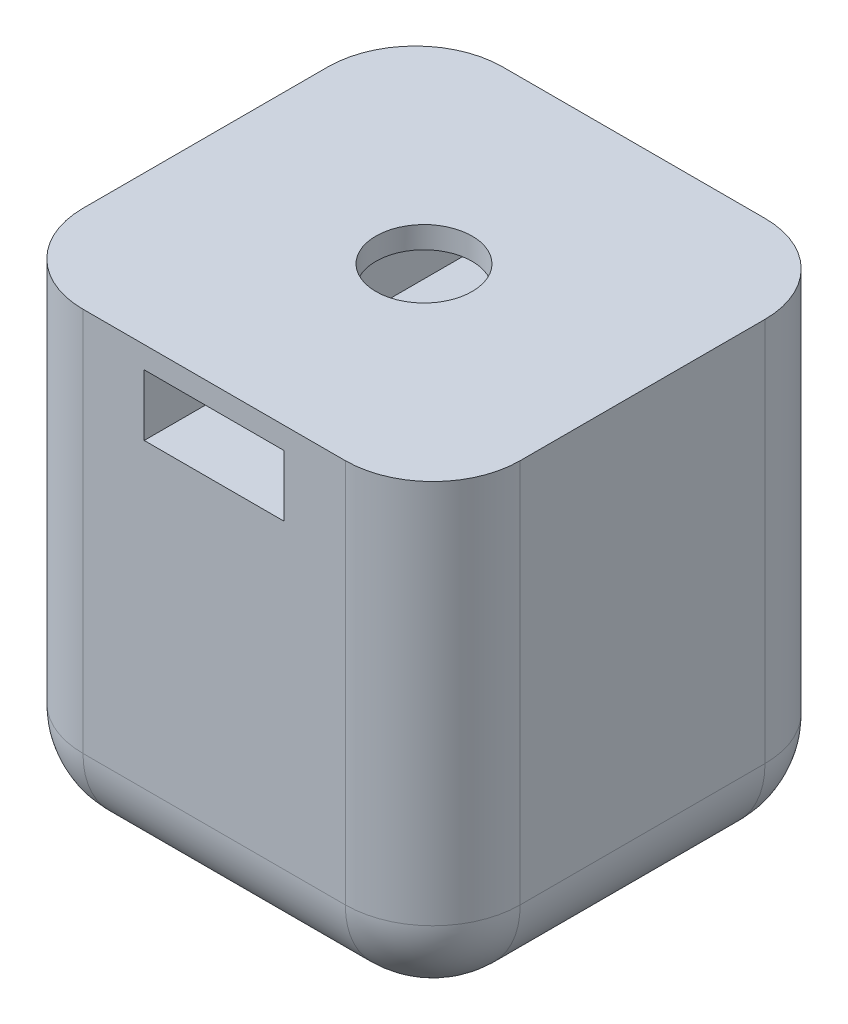
ISO-10303-21;
HEADER;
FILE_DESCRIPTION(('STEP AP214'),'2;1');
FILE_NAME('part.step','',(''),(''),'','','');
FILE_SCHEMA(('AUTOMOTIVE_DESIGN { 1 0 10303 214 1 1 1 1 }'));
ENDSEC;
DATA;
#1=APPLICATION_CONTEXT('core data for automotive mechanical design processes');
#2=APPLICATION_PROTOCOL_DEFINITION('international standard','automotive_design',2000,#1);
#3=PRODUCT_CONTEXT('',#1,'mechanical');
#4=PRODUCT('Part','Part','',(#3));
#5=PRODUCT_RELATED_PRODUCT_CATEGORY('part','',(#4));
#6=PRODUCT_DEFINITION_FORMATION('','',#4);
#7=PRODUCT_DEFINITION_CONTEXT('part definition',#1,'design');
#8=PRODUCT_DEFINITION('design','',#6,#7);
#9=PRODUCT_DEFINITION_SHAPE('','',#8);
#10=(LENGTH_UNIT() NAMED_UNIT(*) SI_UNIT(.MILLI.,.METRE.));
#11=(NAMED_UNIT(*) PLANE_ANGLE_UNIT() SI_UNIT($,.RADIAN.));
#12=(NAMED_UNIT(*) SI_UNIT($,.STERADIAN.) SOLID_ANGLE_UNIT());
#13=UNCERTAINTY_MEASURE_WITH_UNIT(LENGTH_MEASURE(1.E-05),#10,'distance_accuracy_value','');
#14=(GEOMETRIC_REPRESENTATION_CONTEXT(3) GLOBAL_UNCERTAINTY_ASSIGNED_CONTEXT((#13)) GLOBAL_UNIT_ASSIGNED_CONTEXT((#10,
#11,#12)) REPRESENTATION_CONTEXT('',''));
#15=CARTESIAN_POINT('',(0.,0.,0.));
#16=DIRECTION('',(0.,0.,1.));
#17=DIRECTION('',(1.,0.,0.));
#18=AXIS2_PLACEMENT_3D('',#15,#16,#17);
#19=CARTESIAN_POINT('',(0.,0.,0.));
#20=DIRECTION('',(0.,-1.,0.));
#21=DIRECTION('',(0.,0.,-1.));
#22=AXIS2_PLACEMENT_3D('',#19,#20,#21);
#23=PLANE('',#22);
#24=CARTESIAN_POINT('',(0.,0.,-2.));
#25=DIRECTION('',(0.,1.,0.));
#26=DIRECTION('',(0.,0.,1.));
#27=AXIS2_PLACEMENT_3D('',#24,#25,#26);
#28=CIRCLE('',#27,2.75);
#29=CARTESIAN_POINT('',(0.,0.,0.750000000000003));
#30=VERTEX_POINT('',#29);
#31=EDGE_CURVE('E233',#30,#30,#28,.T.);
#32=ORIENTED_EDGE('',*,*,#31,.F.);
#33=EDGE_LOOP('',(#32));
#34=FACE_BOUND('',#33,.T.);
#35=DIRECTION('',(1.,0.,0.));
#36=VECTOR('',#35,1.);
#37=CARTESIAN_POINT('',(0.,0.,10.));
#38=LINE('',#37,#36);
#39=CARTESIAN_POINT('',(-7.5,0.,10.));
#40=VERTEX_POINT('',#39);
#41=CARTESIAN_POINT('',(7.5,0.,10.));
#42=VERTEX_POINT('',#41);
#43=EDGE_CURVE('E378',#40,#42,#38,.T.);
#44=ORIENTED_EDGE('',*,*,#43,.T.);
#45=CARTESIAN_POINT('',(7.5,0.,5.));
#46=DIRECTION('',(0.,-1.,0.));
#47=DIRECTION('',(0.,0.,-1.));
#48=AXIS2_PLACEMENT_3D('',#45,#46,#47);
#49=CIRCLE('',#48,5.);
#50=CARTESIAN_POINT('',(12.5,0.,5.));
#51=VERTEX_POINT('',#50);
#52=EDGE_CURVE('E11',#42,#51,#49,.F.);
#53=ORIENTED_EDGE('',*,*,#52,.T.);
#54=DIRECTION('',(0.,0.,-1.));
#55=VECTOR('',#54,1.);
#56=CARTESIAN_POINT('',(12.5,0.,10.));
#57=LINE('',#56,#55);
#58=CARTESIAN_POINT('',(12.5,0.,-9.));
#59=VERTEX_POINT('',#58);
#60=EDGE_CURVE('E418',#59,#51,#57,.F.);
#61=ORIENTED_EDGE('',*,*,#60,.F.);
#62=CARTESIAN_POINT('',(7.5,0.,-9.));
#63=DIRECTION('',(0.,-1.,0.));
#64=DIRECTION('',(0.,0.,-1.));
#65=AXIS2_PLACEMENT_3D('',#62,#63,#64);
#66=CIRCLE('',#65,5.);
#67=CARTESIAN_POINT('',(7.5,0.,-14.));
#68=VERTEX_POINT('',#67);
#69=EDGE_CURVE('E58',#59,#68,#66,.F.);
#70=ORIENTED_EDGE('',*,*,#69,.T.);
#71=DIRECTION('',(-1.,0.,0.));
#72=VECTOR('',#71,1.);
#73=CARTESIAN_POINT('',(0.,0.,-14.));
#74=LINE('',#73,#72);
#75=CARTESIAN_POINT('',(-7.5,0.,-14.));
#76=VERTEX_POINT('',#75);
#77=EDGE_CURVE('E74',#68,#76,#74,.T.);
#78=ORIENTED_EDGE('',*,*,#77,.T.);
#79=CARTESIAN_POINT('',(-7.5,0.,-9.));
#80=DIRECTION('',(0.,1.,0.));
#81=DIRECTION('',(0.,0.,1.));
#82=AXIS2_PLACEMENT_3D('',#79,#80,#81);
#83=CIRCLE('',#82,5.);
#84=CARTESIAN_POINT('',(-12.5,0.,-9.));
#85=VERTEX_POINT('',#84);
#86=EDGE_CURVE('E445',#85,#76,#83,.F.);
#87=ORIENTED_EDGE('',*,*,#86,.F.);
#88=DIRECTION('',(0.,0.,-1.));
#89=VECTOR('',#88,1.);
#90=CARTESIAN_POINT('',(-12.5,0.,10.));
#91=LINE('',#90,#89);
#92=CARTESIAN_POINT('',(-12.5,0.,5.));
#93=VERTEX_POINT('',#92);
#94=EDGE_CURVE('E389',#93,#85,#91,.T.);
#95=ORIENTED_EDGE('',*,*,#94,.F.);
#96=CARTESIAN_POINT('',(-7.5,0.,5.));
#97=DIRECTION('',(0.,1.,0.));
#98=DIRECTION('',(0.,0.,1.));
#99=AXIS2_PLACEMENT_3D('',#96,#97,#98);
#100=CIRCLE('',#99,5.);
#101=EDGE_CURVE('E385',#40,#93,#100,.F.);
#102=ORIENTED_EDGE('',*,*,#101,.F.);
#103=EDGE_LOOP('',(#44,#53,#61,#70,#78,#87,#95,#102));
#104=FACE_BOUND('',#103,.T.);
#105=ADVANCED_FACE('F49',(#34,#104),#23,.F.);
#106=CARTESIAN_POINT('',(0.,-17.,0.));
#107=DIRECTION('',(0.,-1.,0.));
#108=DIRECTION('',(0.,0.,-1.));
#109=AXIS2_PLACEMENT_3D('',#106,#107,#108);
#110=PLANE('',#109);
#111=CARTESIAN_POINT('',(0.,-17.,-2.));
#112=DIRECTION('',(0.,-1.,0.));
#113=DIRECTION('',(0.,0.,-1.));
#114=AXIS2_PLACEMENT_3D('',#111,#112,#113);
#115=CIRCLE('',#114,9.8);
#116=CARTESIAN_POINT('',(0.,-17.,-11.8));
#117=VERTEX_POINT('',#116);
#118=EDGE_CURVE('E237',#117,#117,#115,.T.);
#119=ORIENTED_EDGE('',*,*,#118,.T.);
#120=EDGE_LOOP('',(#119));
#121=FACE_BOUND('',#120,.T.);
#122=ADVANCED_FACE('F310',(#121),#110,.T.);
#123=CARTESIAN_POINT('',(0.,-27.,0.));
#124=DIRECTION('',(0.,-1.,0.));
#125=DIRECTION('',(0.,0.,-1.));
#126=AXIS2_PLACEMENT_3D('',#123,#124,#125);
#127=PLANE('',#126);
#128=CARTESIAN_POINT('',(0.,-27.,-2.));
#129=DIRECTION('',(0.,-1.,0.));
#130=DIRECTION('',(0.,0.,-1.));
#131=AXIS2_PLACEMENT_3D('',#128,#129,#130);
#132=CIRCLE('',#131,9.8);
#133=CARTESIAN_POINT('',(7.5,-27.,4.30793151516407));
#134=VERTEX_POINT('',#133);
#135=CARTESIAN_POINT('',(6.85857127979291,-27.,5.));
#136=VERTEX_POINT('',#135);
#137=EDGE_CURVE('E246',#134,#136,#132,.T.);
#138=ORIENTED_EDGE('',*,*,#137,.F.);
#139=DIRECTION('',(0.,0.,1.));
#140=VECTOR('',#139,1.);
#141=CARTESIAN_POINT('',(7.5,-27.,0.));
#142=LINE('',#141,#140);
#143=CARTESIAN_POINT('',(7.5,-27.,5.));
#144=VERTEX_POINT('',#143);
#145=EDGE_CURVE('E267',#134,#144,#142,.T.);
#146=ORIENTED_EDGE('',*,*,#145,.T.);
#147=DIRECTION('',(-1.,0.,0.));
#148=VECTOR('',#147,1.);
#149=CARTESIAN_POINT('',(0.,-27.,5.));
#150=LINE('',#149,#148);
#151=EDGE_CURVE('E264',#144,#136,#150,.T.);
#152=ORIENTED_EDGE('',*,*,#151,.T.);
#153=EDGE_LOOP('',(#138,#146,#152));
#154=FACE_BOUND('',#153,.T.);
#155=ADVANCED_FACE('F373',(#154),#127,.T.);
#156=DIRECTION('',(-1.,0.,0.));
#157=VECTOR('',#156,1.);
#158=CARTESIAN_POINT('',(0.,-27.,5.));
#159=LINE('',#158,#157);
#160=CARTESIAN_POINT('',(-6.85857127979291,-27.,5.));
#161=VERTEX_POINT('',#160);
#162=CARTESIAN_POINT('',(-7.5,-27.,5.));
#163=VERTEX_POINT('',#162);
#164=EDGE_CURVE('E257',#161,#163,#159,.T.);
#165=ORIENTED_EDGE('',*,*,#164,.T.);
#166=DIRECTION('',(0.,0.,1.));
#167=VECTOR('',#166,1.);
#168=CARTESIAN_POINT('',(-7.5,-27.,-14.));
#169=LINE('',#168,#167);
#170=CARTESIAN_POINT('',(-7.5,-27.,4.30793151516407));
#171=VERTEX_POINT('',#170);
#172=EDGE_CURVE('E260',#163,#171,#169,.F.);
#173=ORIENTED_EDGE('',*,*,#172,.T.);
#174=EDGE_CURVE('E743',#161,#171,#132,.T.);
#175=ORIENTED_EDGE('',*,*,#174,.F.);
#176=EDGE_LOOP('',(#165,#173,#175));
#177=FACE_BOUND('',#176,.T.);
#178=ADVANCED_FACE('F312',(#177),#127,.T.);
#179=CARTESIAN_POINT('',(6.8585712797929,-27.,-9.));
#180=VERTEX_POINT('',#179);
#181=CARTESIAN_POINT('',(7.5,-27.,-8.30793151516407));
#182=VERTEX_POINT('',#181);
#183=EDGE_CURVE('E242',#180,#182,#132,.T.);
#184=ORIENTED_EDGE('',*,*,#183,.F.);
#185=DIRECTION('',(-1.,0.,0.));
#186=VECTOR('',#185,1.);
#187=CARTESIAN_POINT('',(0.,-27.,-9.));
#188=LINE('',#187,#186);
#189=CARTESIAN_POINT('',(7.5,-27.,-9.));
#190=VERTEX_POINT('',#189);
#191=EDGE_CURVE('E273',#180,#190,#188,.F.);
#192=ORIENTED_EDGE('',*,*,#191,.T.);
#193=DIRECTION('',(0.,0.,1.));
#194=VECTOR('',#193,1.);
#195=CARTESIAN_POINT('',(7.5,-27.,0.));
#196=LINE('',#195,#194);
#197=EDGE_CURVE('E270',#190,#182,#196,.T.);
#198=ORIENTED_EDGE('',*,*,#197,.T.);
#199=EDGE_LOOP('',(#184,#192,#198));
#200=FACE_BOUND('',#199,.T.);
#201=ADVANCED_FACE('F606',(#200),#127,.T.);
#202=CARTESIAN_POINT('',(-7.5,-27.,-8.30793151516407));
#203=VERTEX_POINT('',#202);
#204=CARTESIAN_POINT('',(-6.8585712797929,-27.,-9.));
#205=VERTEX_POINT('',#204);
#206=EDGE_CURVE('E247',#203,#205,#132,.T.);
#207=ORIENTED_EDGE('',*,*,#206,.F.);
#208=DIRECTION('',(0.,0.,1.));
#209=VECTOR('',#208,1.);
#210=CARTESIAN_POINT('',(-7.5,-27.,-14.));
#211=LINE('',#210,#209);
#212=CARTESIAN_POINT('',(-7.5,-27.,-9.));
#213=VERTEX_POINT('',#212);
#214=EDGE_CURVE('E279',#203,#213,#211,.F.);
#215=ORIENTED_EDGE('',*,*,#214,.T.);
#216=DIRECTION('',(-1.,0.,0.));
#217=VECTOR('',#216,1.);
#218=CARTESIAN_POINT('',(0.,-27.,-9.));
#219=LINE('',#218,#217);
#220=EDGE_CURVE('E276',#213,#205,#219,.F.);
#221=ORIENTED_EDGE('',*,*,#220,.T.);
#222=EDGE_LOOP('',(#207,#215,#221));
#223=FACE_BOUND('',#222,.T.);
#224=ADVANCED_FACE('F308',(#223),#127,.T.);
#225=CARTESIAN_POINT('',(0.,-17.,-2.));
#226=DIRECTION('',(0.,-1.,0.));
#227=DIRECTION('',(0.,0.,-1.));
#228=AXIS2_PLACEMENT_3D('',#225,#226,#227);
#229=CYLINDRICAL_SURFACE('',#228,9.8);
#230=ORIENTED_EDGE('',*,*,#118,.F.);
#231=EDGE_LOOP('',(#230));
#232=FACE_BOUND('',#231,.T.);
#233=ORIENTED_EDGE('',*,*,#174,.T.);
#234=CARTESIAN_POINT('',(-7.5,-27.,4.30793151516407));
#235=CARTESIAN_POINT('',(-7.63620021715893,-26.9999742193658,4.14602059318535));
#236=CARTESIAN_POINT('',(-7.76705313468663,-26.9944373435396,3.97976753927116));
#237=CARTESIAN_POINT('',(-8.01740448975888,-26.9747464813245,3.63965145456038));
#238=CARTESIAN_POINT('',(-8.13691445219486,-26.9606013519917,3.46579641589242));
#239=CARTESIAN_POINT('',(-8.3642191409018,-26.9260865631808,3.11118756612205));
#240=CARTESIAN_POINT('',(-8.47201209603152,-26.9057159644304,2.93043271760955));
#241=CARTESIAN_POINT('',(-8.67559437960381,-26.8609511452333,2.56270123067464));
#242=CARTESIAN_POINT('',(-8.77137945154097,-26.8365555050637,2.3757224155615));
#243=CARTESIAN_POINT('',(-8.96659804394256,-26.7813317283755,1.96247558663533));
#244=CARTESIAN_POINT('',(-9.0636540707442,-26.7501309730978,1.73513123012862));
#245=CARTESIAN_POINT('',(-9.24034438332457,-26.6882796039221,1.27369467682066));
#246=CARTESIAN_POINT('',(-9.31997801853788,-26.6576290106068,1.03960222840977));
#247=CARTESIAN_POINT('',(-9.46140035183425,-26.5998640417613,0.565736880537879));
#248=CARTESIAN_POINT('',(-9.52319563464273,-26.5727483634093,0.32596611258742));
#249=CARTESIAN_POINT('',(-9.62855408411762,-26.5246674385487,-0.158175005780959));
#250=CARTESIAN_POINT('',(-9.67211681816071,-26.5037023379849,-0.402545465196958));
#251=CARTESIAN_POINT('',(-9.74411878328034,-26.4683032663425,-0.91968750936938));
#252=CARTESIAN_POINT('',(-9.77055213693126,-26.4547581170751,-1.19280456109208));
#253=CARTESIAN_POINT('',(-9.80040744101724,-26.4394157364693,-1.74063967466751));
#254=CARTESIAN_POINT('',(-9.80382864113238,-26.4376188881889,-2.01535778843117));
#255=CARTESIAN_POINT('',(-9.78760356603332,-26.4460036995191,-2.5641110322284));
#256=CARTESIAN_POINT('',(-9.76794127848705,-26.4561936740437,-2.8381455558715));
#257=CARTESIAN_POINT('',(-9.70580045304758,-26.4872751675052,-3.38297645187299));
#258=CARTESIAN_POINT('',(-9.66332212077418,-26.5081665899998,-3.65377285339108));
#259=CARTESIAN_POINT('',(-9.56110087649859,-26.5557336077235,-4.16489389606989));
#260=CARTESIAN_POINT('',(-9.50335494922638,-26.5816813649849,-4.40569111610965));
#261=CARTESIAN_POINT('',(-9.36997818004612,-26.6377161462438,-4.88177487352488));
#262=CARTESIAN_POINT('',(-9.29434730256969,-26.6678031784731,-5.11706139994002));
#263=CARTESIAN_POINT('',(-9.12569417361237,-26.7291812488241,-5.5808541049803));
#264=CARTESIAN_POINT('',(-9.0326915072776,-26.7604708998539,-5.80936758670171));
#265=CARTESIAN_POINT('',(-8.82965478134572,-26.8211246731212,-6.25887788886015));
#266=CARTESIAN_POINT('',(-8.71962402433617,-26.850489167173,-6.47987615675174));
#267=CARTESIAN_POINT('',(-8.44565270752613,-26.9123501829789,-6.98158379155217));
#268=CARTESIAN_POINT('',(-8.27562863779251,-26.9429394058652,-7.25927596137297));
#269=CARTESIAN_POINT('',(-7.99998681127,-26.9757988666806,-7.66275514611585));
#270=CARTESIAN_POINT('',(-7.90463398910497,-26.9845821031106,-7.79511685525115));
#271=CARTESIAN_POINT('',(-7.70725224192741,-26.9966801027573,-8.05515775482022));
#272=CARTESIAN_POINT('',(-7.6052188499887,-26.999991167403,-8.18283372127523));
#273=CARTESIAN_POINT('',(-7.5,-27.,-8.30793151516407));
#274=B_SPLINE_CURVE_WITH_KNOTS('',3,(#234,#235,#236,#237,#238,#239,#240,#241,#242,#243,#244,
#245,#246,#247,#248,#249,#250,#251,#252,#253,#254,#255,#256,#257,#258,#259,#260,#261,#262,#263,
#264,#265,#266,#267,#268,#269,#270,#271,#272,#273),.UNSPECIFIED.,.F.,.F.,(4,2,2,2,2,2,2,2,2,2,2,
2,2,2,2,2,2,2,2,4),(0.,0.634384526854664,1.26811743465562,1.90194600461116,2.53599862002283,
3.28274720662044,4.02952367262371,4.77602412521864,5.52254228982972,6.34551764739532,
7.16851983825196,7.99209325884876,8.81565925746857,9.56184998730294,10.3080422011235,
11.0533981724876,11.7986097632795,12.777600269696,13.2674472725849,13.7576252216089),.UNSPECIFIED.);
#275=EDGE_CURVE('E325',#171,#203,#274,.T.);
#276=ORIENTED_EDGE('',*,*,#275,.T.);
#277=ORIENTED_EDGE('',*,*,#206,.T.);
#278=CARTESIAN_POINT('',(-6.8585712797929,-27.,-9.));
#279=CARTESIAN_POINT('',(-6.70686136787172,-26.9999776550605,-9.14867950706657));
#280=CARTESIAN_POINT('',(-6.55039243565463,-26.9933720768076,-9.29228566234191));
#281=CARTESIAN_POINT('',(-6.22914570326008,-26.9695101171746,-9.56851530520233));
#282=CARTESIAN_POINT('',(-6.06437921801865,-26.9522678975961,-9.70115313035718));
#283=CARTESIAN_POINT('',(-5.72787633423142,-26.9097030462111,-9.95460328998723));
#284=CARTESIAN_POINT('',(-5.55616387548337,-26.8844063960842,-10.075452037861));
#285=CARTESIAN_POINT('',(-5.2059657122263,-26.8280044984096,-10.3055298234121));
#286=CARTESIAN_POINT('',(-5.02747735679998,-26.7968969584273,-10.4147542484302));
#287=CARTESIAN_POINT('',(-4.64412021497212,-26.7274017771795,-10.6328481025935));
#288=CARTESIAN_POINT('',(-4.43853131770845,-26.6885890836975,-10.7403158247987));
#289=CARTESIAN_POINT('',(-4.02051691093443,-26.6094214053527,-10.9403092508416));
#290=CARTESIAN_POINT('',(-3.80809155718604,-26.5690664556249,-11.0328352948222));
#291=CARTESIAN_POINT('',(-3.37672435178635,-26.4895972244733,-11.2028007082571));
#292=CARTESIAN_POINT('',(-3.15777434530002,-26.4504846336856,-11.280220199705));
#293=CARTESIAN_POINT('',(-2.71430378358985,-26.3763404144782,-11.4194776173714));
#294=CARTESIAN_POINT('',(-2.48978374894269,-26.3413084064157,-11.4813169937313));
#295=CARTESIAN_POINT('',(-2.03429498527757,-26.2777231607663,-11.5894122645284));
#296=CARTESIAN_POINT('',(-1.80329071031727,-26.2492200545791,-11.6355488179339));
#297=CARTESIAN_POINT('',(-1.3376175323324,-26.2013910635629,-11.7111484561082));
#298=CARTESIAN_POINT('',(-1.10294886514816,-26.1820645906196,-11.740612609405));
#299=CARTESIAN_POINT('',(-0.63187075314799,-26.154341016632,-11.782460947832));
#300=CARTESIAN_POINT('',(-0.395465336278335,-26.145923744277,-11.7948766583801));
#301=CARTESIAN_POINT('',(0.0777521309731572,-26.1407423973748,-11.8025481295675));
#302=CARTESIAN_POINT('',(0.314564174787,-26.143978136341,-11.7978041648182));
#303=CARTESIAN_POINT('',(0.786450002372503,-26.161782990553,-11.7712471119491));
#304=CARTESIAN_POINT('',(1.02152576782163,-26.1763361030158,-11.7494581252577));
#305=CARTESIAN_POINT('',(1.48866751339083,-26.2154275545385,-11.6891356945955));
#306=CARTESIAN_POINT('',(1.72073328844059,-26.2399665702877,-11.6506011158566));
#307=CARTESIAN_POINT('',(2.18118860707212,-26.2970153015157,-11.5570797962473));
#308=CARTESIAN_POINT('',(2.40956599364487,-26.3295472120654,-11.5020471473825));
#309=CARTESIAN_POINT('',(2.86103055454172,-26.3999784227381,-11.3760039180952));
#310=CARTESIAN_POINT('',(3.08411695477822,-26.4378785026544,-11.3049910154584));
#311=CARTESIAN_POINT('',(3.53948443173601,-26.5189683610221,-11.1419102768116));
#312=CARTESIAN_POINT('',(3.77133235005817,-26.562342699016,-11.0487248998925));
#313=CARTESIAN_POINT('',(4.22737622260336,-26.6485169553556,-10.8448678408766));
#314=CARTESIAN_POINT('',(4.4515706510588,-26.6913167581445,-10.7341926965634));
#315=CARTESIAN_POINT('',(4.89070221939834,-26.772583375573,-10.4960695875147));
#316=CARTESIAN_POINT('',(5.10566809242418,-26.8110643492541,-10.3686795901576));
#317=CARTESIAN_POINT('',(5.52603308732341,-26.8801263604527,-10.0972528177586));
#318=CARTESIAN_POINT('',(5.73143790129792,-26.9107121489169,-9.95322612977619));
#319=CARTESIAN_POINT('',(6.09352536499747,-26.955403357382,-9.67791379325846));
#320=CARTESIAN_POINT('',(6.25205745372529,-26.9715346804888,-9.54939619155543));
#321=CARTESIAN_POINT('',(6.56139869126086,-26.9938302577447,-9.2821695391227));
#322=CARTESIAN_POINT('',(6.71219644823331,-26.9999801967929,-9.1434461487747));
#323=CARTESIAN_POINT('',(6.8585712797929,-27.,-9.));
#324=B_SPLINE_CURVE_WITH_KNOTS('',3,(#278,#279,#280,#281,#282,#283,#284,#285,#286,#287,#288,
#289,#290,#291,#292,#293,#294,#295,#296,#297,#298,#299,#300,#301,#302,#303,#304,#305,#306,#307,
#308,#309,#310,#311,#312,#313,#314,#315,#316,#317,#318,#319,#320,#321,#322,#323),.UNSPECIFIED.,
.F.,.F.,(4,2,2,2,2,2,2,2,2,2,2,2,2,2,2,2,2,2,2,2,2,2,4),(0.,0.636823343674346,1.27280063461693,
1.90674685136685,2.54094369431386,3.24596169175623,3.95096363741256,4.65688709720953,
5.36274482788171,6.07385315182824,6.78491589593976,7.4946619874855,8.20439672080144,
8.91312970886336,9.62191073183877,10.3326826302218,11.0435578831427,11.8036633753717,
12.5639195244908,13.321605537113,14.0788345418439,14.6923798999628,15.3068044174464),.UNSPECIFIED.);
#325=EDGE_CURVE('E318',#205,#180,#324,.T.);
#326=ORIENTED_EDGE('',*,*,#325,.T.);
#327=ORIENTED_EDGE('',*,*,#183,.T.);
#328=CARTESIAN_POINT('',(7.5,-27.,-8.30793151516407));
#329=CARTESIAN_POINT('',(7.63620021715893,-26.9999742193658,-8.14602059318534));
#330=CARTESIAN_POINT('',(7.76705313468663,-26.9944373435396,-7.97976753927115));
#331=CARTESIAN_POINT('',(8.01740448975888,-26.9747464813245,-7.63965145456038));
#332=CARTESIAN_POINT('',(8.13691445219486,-26.9606013519917,-7.46579641589241));
#333=CARTESIAN_POINT('',(8.3642191409018,-26.9260865631808,-7.11118756612205));
#334=CARTESIAN_POINT('',(8.47201209603152,-26.9057159644304,-6.93043271760954));
#335=CARTESIAN_POINT('',(8.67559437960381,-26.8609511452333,-6.56270123067464));
#336=CARTESIAN_POINT('',(8.77137945154097,-26.8365555050637,-6.37572241556149));
#337=CARTESIAN_POINT('',(8.96659804394256,-26.7813317283755,-5.96247558663532));
#338=CARTESIAN_POINT('',(9.0636540707442,-26.7501309730978,-5.73513123012861));
#339=CARTESIAN_POINT('',(9.24034438332457,-26.6882796039221,-5.27369467682066));
#340=CARTESIAN_POINT('',(9.31997801853789,-26.6576290106068,-5.03960222840977));
#341=CARTESIAN_POINT('',(9.46140035183425,-26.5998640417613,-4.56573688053787));
#342=CARTESIAN_POINT('',(9.52319563464273,-26.5727483634093,-4.32596611258741));
#343=CARTESIAN_POINT('',(9.62855408411762,-26.5246674385487,-3.84182499421903));
#344=CARTESIAN_POINT('',(9.67211681816071,-26.5037023379849,-3.59745453480303));
#345=CARTESIAN_POINT('',(9.74411878328034,-26.4683032663425,-3.08031249063061));
#346=CARTESIAN_POINT('',(9.77055213693126,-26.4547581170751,-2.80719543890791));
#347=CARTESIAN_POINT('',(9.80040744101724,-26.4394157364693,-2.25936032533248));
#348=CARTESIAN_POINT('',(9.80382864113238,-26.4376188881889,-1.98464221156883));
#349=CARTESIAN_POINT('',(9.78760356603332,-26.4460036995191,-1.43588896777159));
#350=CARTESIAN_POINT('',(9.76794127848705,-26.4561936740437,-1.16185444412849));
#351=CARTESIAN_POINT('',(9.70580045304758,-26.4872751675052,-0.617023548127005));
#352=CARTESIAN_POINT('',(9.66332212077418,-26.5081665899998,-0.346227146608913));
#353=CARTESIAN_POINT('',(9.56110087649859,-26.5557336077235,0.164893896069893));
#354=CARTESIAN_POINT('',(9.50335494922638,-26.5816813649849,0.40569111610966));
#355=CARTESIAN_POINT('',(9.36997818004612,-26.6377161462438,0.88177487352489));
#356=CARTESIAN_POINT('',(9.29434730256969,-26.6678031784731,1.11706139994003));
#357=CARTESIAN_POINT('',(9.12569417361237,-26.7291812488241,1.5808541049803));
#358=CARTESIAN_POINT('',(9.0326915072776,-26.7604708998539,1.80936758670172));
#359=CARTESIAN_POINT('',(8.82965478134572,-26.8211246731212,2.25887788886015));
#360=CARTESIAN_POINT('',(8.71962402433617,-26.850489167173,2.47987615675174));
#361=CARTESIAN_POINT('',(8.44565270752613,-26.9123501829789,2.98158379155218));
#362=CARTESIAN_POINT('',(8.2756286377925,-26.9429394058652,3.25927596137298));
#363=CARTESIAN_POINT('',(7.99998681127,-26.9757988666806,3.66275514611586));
#364=CARTESIAN_POINT('',(7.90463398910497,-26.9845821031106,3.79511685525115));
#365=CARTESIAN_POINT('',(7.70725224192741,-26.9966801027573,4.05515775482023));
#366=CARTESIAN_POINT('',(7.6052188499887,-26.999991167403,4.18283372127524));
#367=CARTESIAN_POINT('',(7.5,-27.,4.30793151516407));
#368=B_SPLINE_CURVE_WITH_KNOTS('',3,(#328,#329,#330,#331,#332,#333,#334,#335,#336,#337,#338,
#339,#340,#341,#342,#343,#344,#345,#346,#347,#348,#349,#350,#351,#352,#353,#354,#355,#356,#357,
#358,#359,#360,#361,#362,#363,#364,#365,#366,#367),.UNSPECIFIED.,.F.,.F.,(4,2,2,2,2,2,2,2,2,2,2,
2,2,2,2,2,2,2,2,4),(0.,0.634384526854664,1.26811743465562,1.90194600461116,2.53599862002283,
3.28274720662044,4.02952367262371,4.77602412521864,5.52254228982972,6.34551764739532,
7.16851983825196,7.99209325884876,8.81565925746858,9.56184998730294,10.3080422011235,
11.0533981724876,11.7986097632795,12.777600269696,13.2674472725849,13.7576252216089),.UNSPECIFIED.);
#369=EDGE_CURVE('E291',#182,#134,#368,.T.);
#370=ORIENTED_EDGE('',*,*,#369,.T.);
#371=ORIENTED_EDGE('',*,*,#137,.T.);
#372=CARTESIAN_POINT('',(6.85857127979291,-27.,5.));
#373=CARTESIAN_POINT('',(6.70686136787173,-26.9999776550605,5.14867950706657));
#374=CARTESIAN_POINT('',(6.55039243565463,-26.9933720768076,5.29228566234191));
#375=CARTESIAN_POINT('',(6.22914570326008,-26.9695101171746,5.56851530520233));
#376=CARTESIAN_POINT('',(6.06437921801866,-26.9522678975961,5.70115313035718));
#377=CARTESIAN_POINT('',(5.72787633423142,-26.9097030462111,5.95460328998723));
#378=CARTESIAN_POINT('',(5.55616387548338,-26.8844063960842,6.07545203786102));
#379=CARTESIAN_POINT('',(5.2059657122263,-26.8280044984096,6.30552982341213));
#380=CARTESIAN_POINT('',(5.02747735679999,-26.7968969584273,6.41475424843023));
#381=CARTESIAN_POINT('',(4.64412021497213,-26.7274017771795,6.63284810259348));
#382=CARTESIAN_POINT('',(4.43853131770846,-26.6885890836975,6.7403158247987));
#383=CARTESIAN_POINT('',(4.02051691093444,-26.6094214053527,6.94030925084163));
#384=CARTESIAN_POINT('',(3.80809155718605,-26.5690664556249,7.03283529482216));
#385=CARTESIAN_POINT('',(3.37672435178636,-26.4895972244733,7.20280070825712));
#386=CARTESIAN_POINT('',(3.15777434530002,-26.4504846336856,7.280220199705));
#387=CARTESIAN_POINT('',(2.71430378358986,-26.3763404144782,7.41947761737139));
#388=CARTESIAN_POINT('',(2.4897837489427,-26.3413084064157,7.48131699373131));
#389=CARTESIAN_POINT('',(2.03429498527758,-26.2777231607663,7.58941226452838));
#390=CARTESIAN_POINT('',(1.80329071031728,-26.2492200545791,7.63554881793388));
#391=CARTESIAN_POINT('',(1.33761753233241,-26.2013910635629,7.71114845610819));
#392=CARTESIAN_POINT('',(1.10294886514818,-26.1820645906196,7.74061260940502));
#393=CARTESIAN_POINT('',(0.631870753148005,-26.154341016632,7.78246094783202));
#394=CARTESIAN_POINT('',(0.39546533627835,-26.145923744277,7.79487665838011));
#395=CARTESIAN_POINT('',(-0.0777521309731421,-26.1407423973748,7.80254812956747));
#396=CARTESIAN_POINT('',(-0.314564174786985,-26.143978136341,7.79780416481818));
#397=CARTESIAN_POINT('',(-0.786450002372488,-26.161782990553,7.7712471119491));
#398=CARTESIAN_POINT('',(-1.02152576782161,-26.1763361030158,7.74945812525766));
#399=CARTESIAN_POINT('',(-1.48866751339081,-26.2154275545385,7.68913569459551));
#400=CARTESIAN_POINT('',(-1.72073328844058,-26.2399665702877,7.65060111585665));
#401=CARTESIAN_POINT('',(-2.18118860707211,-26.2970153015157,7.55707979624733));
#402=CARTESIAN_POINT('',(-2.40956599364485,-26.3295472120654,7.50204714738252));
#403=CARTESIAN_POINT('',(-2.8610305545417,-26.3999784227381,7.37600391809521));
#404=CARTESIAN_POINT('',(-3.0841169547782,-26.4378785026544,7.30499101545843));
#405=CARTESIAN_POINT('',(-3.539484431736,-26.5189683610221,7.14191027681166));
#406=CARTESIAN_POINT('',(-3.77133235005816,-26.562342699016,7.04872489989248));
#407=CARTESIAN_POINT('',(-4.22737622260335,-26.6485169553556,6.84486784087657));
#408=CARTESIAN_POINT('',(-4.45157065105879,-26.6913167581445,6.73419269656337));
#409=CARTESIAN_POINT('',(-4.89070221939832,-26.772583375573,6.49606958751474));
#410=CARTESIAN_POINT('',(-5.10566809242417,-26.8110643492541,6.36867959015763));
#411=CARTESIAN_POINT('',(-5.52603308732339,-26.8801263604527,6.09725281775865));
#412=CARTESIAN_POINT('',(-5.73143790129791,-26.9107121489169,5.95322612977621));
#413=CARTESIAN_POINT('',(-6.09352536499745,-26.955403357382,5.67791379325848));
#414=CARTESIAN_POINT('',(-6.25205745372528,-26.9715346804888,5.54939619155544));
#415=CARTESIAN_POINT('',(-6.56139869126086,-26.9938302577447,5.28216953912271));
#416=CARTESIAN_POINT('',(-6.71219644823331,-26.9999801967929,5.1434461487747));
#417=CARTESIAN_POINT('',(-6.85857127979291,-27.,5.));
#418=B_SPLINE_CURVE_WITH_KNOTS('',3,(#372,#373,#374,#375,#376,#377,#378,#379,#380,#381,#382,
#383,#384,#385,#386,#387,#388,#389,#390,#391,#392,#393,#394,#395,#396,#397,#398,#399,#400,#401,
#402,#403,#404,#405,#406,#407,#408,#409,#410,#411,#412,#413,#414,#415,#416,#417),.UNSPECIFIED.,
.F.,.F.,(4,2,2,2,2,2,2,2,2,2,2,2,2,2,2,2,2,2,2,2,2,2,4),(0.,0.636823343674346,1.27280063461693,
1.90674685136685,2.54094369431386,3.24596169175623,3.95096363741256,4.65688709720953,
5.36274482788171,6.07385315182823,6.78491589593975,7.4946619874855,8.20439672080144,
8.91312970886336,9.62191073183877,10.3326826302218,11.0435578831427,11.8036633753716,
12.5639195244907,13.321605537113,14.0788345418439,14.6923798999628,15.3068044174465),.UNSPECIFIED.);
#419=EDGE_CURVE('E282',#136,#161,#418,.T.);
#420=ORIENTED_EDGE('',*,*,#419,.T.);
#421=EDGE_LOOP('',(#233,#276,#277,#326,#327,#370,#371,#420));
#422=FACE_BOUND('',#421,.T.);
#423=ADVANCED_FACE('F302',(#232,#422),#229,.F.);
#424=CARTESIAN_POINT('',(7.5,-22.,0.));
#425=DIRECTION('',(0.,0.,1.));
#426=DIRECTION('',(1.,0.,0.));
#427=AXIS2_PLACEMENT_3D('',#424,#425,#426);
#428=CYLINDRICAL_SURFACE('',#427,5.);
#429=CARTESIAN_POINT('',(7.5,-22.,-9.));
#430=DIRECTION('',(0.,0.,-1.));
#431=DIRECTION('',(-1.,0.,0.));
#432=AXIS2_PLACEMENT_3D('',#429,#430,#431);
#433=CIRCLE('',#432,5.);
#434=CARTESIAN_POINT('',(12.5,-22.,-9.));
#435=VERTEX_POINT('',#434);
#436=EDGE_CURVE('E464',#435,#190,#433,.T.);
#437=ORIENTED_EDGE('',*,*,#436,.F.);
#438=DIRECTION('',(0.,0.,1.));
#439=VECTOR('',#438,1.);
#440=CARTESIAN_POINT('',(12.5,-22.,0.));
#441=LINE('',#440,#439);
#442=CARTESIAN_POINT('',(12.5,-22.,5.));
#443=VERTEX_POINT('',#442);
#444=EDGE_CURVE('E407',#443,#435,#441,.F.);
#445=ORIENTED_EDGE('',*,*,#444,.F.);
#446=CARTESIAN_POINT('',(7.5,-22.,5.));
#447=DIRECTION('',(0.,0.,1.));
#448=DIRECTION('',(1.,0.,0.));
#449=AXIS2_PLACEMENT_3D('',#446,#447,#448);
#450=CIRCLE('',#449,5.);
#451=EDGE_CURVE('E453',#144,#443,#450,.T.);
#452=ORIENTED_EDGE('',*,*,#451,.F.);
#453=ORIENTED_EDGE('',*,*,#145,.F.);
#454=ORIENTED_EDGE('',*,*,#369,.F.);
#455=ORIENTED_EDGE('',*,*,#197,.F.);
#456=EDGE_LOOP('',(#437,#445,#452,#453,#454,#455));
#457=FACE_BOUND('',#456,.T.);
#458=ADVANCED_FACE('F307',(#457),#428,.T.);
#459=CARTESIAN_POINT('',(-7.5,-22.,0.));
#460=DIRECTION('',(0.,0.,-1.));
#461=DIRECTION('',(-1.,0.,0.));
#462=AXIS2_PLACEMENT_3D('',#459,#460,#461);
#463=CYLINDRICAL_SURFACE('',#462,5.);
#464=ORIENTED_EDGE('',*,*,#275,.F.);
#465=ORIENTED_EDGE('',*,*,#172,.F.);
#466=CARTESIAN_POINT('',(-7.5,-22.,5.));
#467=DIRECTION('',(0.,0.,1.));
#468=DIRECTION('',(1.,0.,0.));
#469=AXIS2_PLACEMENT_3D('',#466,#467,#468);
#470=CIRCLE('',#469,5.);
#471=CARTESIAN_POINT('',(-12.5,-22.,5.));
#472=VERTEX_POINT('',#471);
#473=EDGE_CURVE('E232',#163,#472,#470,.F.);
#474=ORIENTED_EDGE('',*,*,#473,.T.);
#475=DIRECTION('',(0.,0.,1.));
#476=VECTOR('',#475,1.);
#477=CARTESIAN_POINT('',(-12.5,-22.,10.));
#478=LINE('',#477,#476);
#479=CARTESIAN_POINT('',(-12.5,-22.,-9.));
#480=VERTEX_POINT('',#479);
#481=EDGE_CURVE('E250',#480,#472,#478,.T.);
#482=ORIENTED_EDGE('',*,*,#481,.F.);
#483=CARTESIAN_POINT('',(-7.5,-22.,-9.));
#484=DIRECTION('',(0.,0.,-1.));
#485=DIRECTION('',(-1.,0.,0.));
#486=AXIS2_PLACEMENT_3D('',#483,#484,#485);
#487=CIRCLE('',#486,5.);
#488=EDGE_CURVE('E421',#480,#213,#487,.F.);
#489=ORIENTED_EDGE('',*,*,#488,.T.);
#490=ORIENTED_EDGE('',*,*,#214,.F.);
#491=EDGE_LOOP('',(#464,#465,#474,#482,#489,#490));
#492=FACE_BOUND('',#491,.T.);
#493=ADVANCED_FACE('F351',(#492),#463,.T.);
#494=CARTESIAN_POINT('',(0.,-22.,5.));
#495=DIRECTION('',(-1.,0.,0.));
#496=DIRECTION('',(0.,0.,1.));
#497=AXIS2_PLACEMENT_3D('',#494,#495,#496);
#498=CYLINDRICAL_SURFACE('',#497,5.);
#499=CARTESIAN_POINT('',(7.5,-22.,5.));
#500=DIRECTION('',(1.,0.,0.));
#501=DIRECTION('',(0.,0.,-1.));
#502=AXIS2_PLACEMENT_3D('',#499,#500,#501);
#503=CIRCLE('',#502,5.);
#504=CARTESIAN_POINT('',(7.5,-22.,10.));
#505=VERTEX_POINT('',#504);
#506=EDGE_CURVE('E440',#144,#505,#503,.F.);
#507=ORIENTED_EDGE('',*,*,#506,.T.);
#508=DIRECTION('',(-1.,0.,0.));
#509=VECTOR('',#508,1.);
#510=CARTESIAN_POINT('',(0.,-22.,10.));
#511=LINE('',#510,#509);
#512=CARTESIAN_POINT('',(-7.5,-22.,10.));
#513=VERTEX_POINT('',#512);
#514=EDGE_CURVE('E395',#513,#505,#511,.F.);
#515=ORIENTED_EDGE('',*,*,#514,.F.);
#516=CARTESIAN_POINT('',(-7.5,-22.,5.));
#517=DIRECTION('',(-1.,0.,0.));
#518=DIRECTION('',(0.,0.,1.));
#519=AXIS2_PLACEMENT_3D('',#516,#517,#518);
#520=CIRCLE('',#519,5.);
#521=EDGE_CURVE('E425',#163,#513,#520,.T.);
#522=ORIENTED_EDGE('',*,*,#521,.F.);
#523=ORIENTED_EDGE('',*,*,#164,.F.);
#524=ORIENTED_EDGE('',*,*,#419,.F.);
#525=ORIENTED_EDGE('',*,*,#151,.F.);
#526=EDGE_LOOP('',(#507,#515,#522,#523,#524,#525));
#527=FACE_BOUND('',#526,.T.);
#528=ADVANCED_FACE('F298',(#527),#498,.T.);
#529=CARTESIAN_POINT('',(0.,-22.,-9.));
#530=DIRECTION('',(-1.,0.,0.));
#531=DIRECTION('',(0.,0.,1.));
#532=AXIS2_PLACEMENT_3D('',#529,#530,#531);
#533=CYLINDRICAL_SURFACE('',#532,5.);
#534=ORIENTED_EDGE('',*,*,#325,.F.);
#535=ORIENTED_EDGE('',*,*,#220,.F.);
#536=CARTESIAN_POINT('',(-7.5,-22.,-9.));
#537=DIRECTION('',(-1.,0.,0.));
#538=DIRECTION('',(0.,0.,1.));
#539=AXIS2_PLACEMENT_3D('',#536,#537,#538);
#540=CIRCLE('',#539,5.);
#541=CARTESIAN_POINT('',(-7.5,-22.,-14.));
#542=VERTEX_POINT('',#541);
#543=EDGE_CURVE('E436',#542,#213,#540,.T.);
#544=ORIENTED_EDGE('',*,*,#543,.F.);
#545=DIRECTION('',(-1.,0.,0.));
#546=VECTOR('',#545,1.);
#547=CARTESIAN_POINT('',(0.,-22.,-14.));
#548=LINE('',#547,#546);
#549=CARTESIAN_POINT('',(7.5,-22.,-14.));
#550=VERTEX_POINT('',#549);
#551=EDGE_CURVE('E758',#550,#542,#548,.T.);
#552=ORIENTED_EDGE('',*,*,#551,.F.);
#553=CARTESIAN_POINT('',(7.5,-22.,-9.));
#554=DIRECTION('',(1.,0.,0.));
#555=DIRECTION('',(0.,0.,-1.));
#556=AXIS2_PLACEMENT_3D('',#553,#554,#555);
#557=CIRCLE('',#556,5.);
#558=EDGE_CURVE('E449',#550,#190,#557,.F.);
#559=ORIENTED_EDGE('',*,*,#558,.T.);
#560=ORIENTED_EDGE('',*,*,#191,.F.);
#561=EDGE_LOOP('',(#534,#535,#544,#552,#559,#560));
#562=FACE_BOUND('',#561,.T.);
#563=ADVANCED_FACE('F332',(#562),#533,.T.);
#564=CARTESIAN_POINT('',(7.5,-22.,-9.));
#565=DIRECTION('',(1.,0.,0.));
#566=DIRECTION('',(0.,0.,-1.));
#567=AXIS2_PLACEMENT_3D('',#564,#565,#566);
#568=SPHERICAL_SURFACE('',#567,5.);
#569=CARTESIAN_POINT('',(7.5,-22.,-9.));
#570=DIRECTION('',(0.,-1.,0.));
#571=DIRECTION('',(0.,0.,-1.));
#572=AXIS2_PLACEMENT_3D('',#569,#570,#571);
#573=CIRCLE('',#572,5.);
#574=EDGE_CURVE('E457',#550,#435,#573,.T.);
#575=ORIENTED_EDGE('',*,*,#574,.T.);
#576=ORIENTED_EDGE('',*,*,#436,.T.);
#577=ORIENTED_EDGE('',*,*,#558,.F.);
#578=EDGE_LOOP('',(#575,#576,#577));
#579=FACE_BOUND('',#578,.T.);
#580=ADVANCED_FACE('F337',(#579),#568,.T.);
#581=CARTESIAN_POINT('',(12.5,-0.5,0.));
#582=DIRECTION('',(1.,0.,0.));
#583=DIRECTION('',(0.,0.,-1.));
#584=AXIS2_PLACEMENT_3D('',#581,#582,#583);
#585=PLANE('',#584);
#586=DIRECTION('',(0.,-1.,0.));
#587=VECTOR('',#586,1.);
#588=CARTESIAN_POINT('',(12.5,-0.5,5.));
#589=LINE('',#588,#587);
#590=EDGE_CURVE('E400',#51,#443,#589,.T.);
#591=ORIENTED_EDGE('',*,*,#590,.T.);
#592=ORIENTED_EDGE('',*,*,#444,.T.);
#593=DIRECTION('',(0.,-1.,0.));
#594=VECTOR('',#593,1.);
#595=CARTESIAN_POINT('',(12.5,-0.5,-9.));
#596=LINE('',#595,#594);
#597=EDGE_CURVE('E412',#435,#59,#596,.F.);
#598=ORIENTED_EDGE('',*,*,#597,.T.);
#599=ORIENTED_EDGE('',*,*,#60,.T.);
#600=EDGE_LOOP('',(#591,#592,#598,#599));
#601=FACE_BOUND('',#600,.T.);
#602=ADVANCED_FACE('F344',(#601),#585,.T.);
#603=CARTESIAN_POINT('',(7.5,-22.,5.));
#604=DIRECTION('',(1.,0.,0.));
#605=DIRECTION('',(0.,0.,-1.));
#606=AXIS2_PLACEMENT_3D('',#603,#604,#605);
#607=SPHERICAL_SURFACE('',#606,5.);
#608=ORIENTED_EDGE('',*,*,#451,.T.);
#609=CARTESIAN_POINT('',(7.5,-22.,5.));
#610=DIRECTION('',(0.,-1.,0.));
#611=DIRECTION('',(0.,0.,-1.));
#612=AXIS2_PLACEMENT_3D('',#609,#610,#611);
#613=CIRCLE('',#612,5.);
#614=EDGE_CURVE('E402',#443,#505,#613,.T.);
#615=ORIENTED_EDGE('',*,*,#614,.T.);
#616=ORIENTED_EDGE('',*,*,#506,.F.);
#617=EDGE_LOOP('',(#608,#615,#616));
#618=FACE_BOUND('',#617,.T.);
#619=ADVANCED_FACE('F340',(#618),#607,.T.);
#620=CARTESIAN_POINT('',(0.,0.,10.));
#621=DIRECTION('',(0.,0.,1.));
#622=DIRECTION('',(1.,0.,0.));
#623=AXIS2_PLACEMENT_3D('',#620,#621,#622);
#624=PLANE('',#623);
#625=DIRECTION('',(0.,1.,0.));
#626=VECTOR('',#625,1.);
#627=CARTESIAN_POINT('',(4.,-1.25,10.));
#628=LINE('',#627,#626);
#629=CARTESIAN_POINT('',(4.,-4.75,10.));
#630=VERTEX_POINT('',#629);
#631=CARTESIAN_POINT('',(4.,-1.25,10.));
#632=VERTEX_POINT('',#631);
#633=EDGE_CURVE('E66',#630,#632,#628,.T.);
#634=ORIENTED_EDGE('',*,*,#633,.F.);
#635=DIRECTION('',(1.,0.,0.));
#636=VECTOR('',#635,1.);
#637=CARTESIAN_POINT('',(-4.,-4.75,10.));
#638=LINE('',#637,#636);
#639=CARTESIAN_POINT('',(-4.,-4.75,10.));
#640=VERTEX_POINT('',#639);
#641=EDGE_CURVE('E200',#640,#630,#638,.T.);
#642=ORIENTED_EDGE('',*,*,#641,.F.);
#643=DIRECTION('',(0.,-1.,0.));
#644=VECTOR('',#643,1.);
#645=CARTESIAN_POINT('',(-4.,-1.25,10.));
#646=LINE('',#645,#644);
#647=CARTESIAN_POINT('',(-4.,-1.25,10.));
#648=VERTEX_POINT('',#647);
#649=EDGE_CURVE('E204',#648,#640,#646,.T.);
#650=ORIENTED_EDGE('',*,*,#649,.F.);
#651=DIRECTION('',(-1.,0.,0.));
#652=VECTOR('',#651,1.);
#653=CARTESIAN_POINT('',(-4.,-1.25,10.));
#654=LINE('',#653,#652);
#655=EDGE_CURVE('E213',#632,#648,#654,.T.);
#656=ORIENTED_EDGE('',*,*,#655,.F.);
#657=EDGE_LOOP('',(#634,#642,#650,#656));
#658=FACE_BOUND('',#657,.T.);
#659=DIRECTION('',(0.,-1.,0.));
#660=VECTOR('',#659,1.);
#661=CARTESIAN_POINT('',(-7.5,-27.,10.));
#662=LINE('',#661,#660);
#663=EDGE_CURVE('E398',#40,#513,#662,.T.);
#664=ORIENTED_EDGE('',*,*,#663,.T.);
#665=ORIENTED_EDGE('',*,*,#514,.T.);
#666=DIRECTION('',(0.,-1.,0.));
#667=VECTOR('',#666,1.);
#668=CARTESIAN_POINT('',(7.5,0.,10.));
#669=LINE('',#668,#667);
#670=EDGE_CURVE('E393',#505,#42,#669,.F.);
#671=ORIENTED_EDGE('',*,*,#670,.T.);
#672=ORIENTED_EDGE('',*,*,#43,.F.);
#673=EDGE_LOOP('',(#664,#665,#671,#672));
#674=FACE_BOUND('',#673,.T.);
#675=ADVANCED_FACE('F343',(#658,#674),#624,.T.);
#676=CARTESIAN_POINT('',(-7.5,-22.,5.));
#677=DIRECTION('',(0.,0.,1.));
#678=DIRECTION('',(1.,0.,0.));
#679=AXIS2_PLACEMENT_3D('',#676,#677,#678);
#680=SPHERICAL_SURFACE('',#679,5.);
#681=ORIENTED_EDGE('',*,*,#521,.T.);
#682=CARTESIAN_POINT('',(-7.5,-22.,5.));
#683=DIRECTION('',(0.,-1.,0.));
#684=DIRECTION('',(0.,0.,-1.));
#685=AXIS2_PLACEMENT_3D('',#682,#683,#684);
#686=CIRCLE('',#685,5.);
#687=EDGE_CURVE('E429',#513,#472,#686,.T.);
#688=ORIENTED_EDGE('',*,*,#687,.T.);
#689=ORIENTED_EDGE('',*,*,#473,.F.);
#690=EDGE_LOOP('',(#681,#688,#689));
#691=FACE_BOUND('',#690,.T.);
#692=ADVANCED_FACE('F631',(#691),#680,.T.);
#693=CARTESIAN_POINT('',(-12.5,-0.5,0.));
#694=DIRECTION('',(1.,0.,0.));
#695=DIRECTION('',(0.,0.,-1.));
#696=AXIS2_PLACEMENT_3D('',#693,#694,#695);
#697=PLANE('',#696);
#698=DIRECTION('',(0.,-1.,0.));
#699=VECTOR('',#698,1.);
#700=CARTESIAN_POINT('',(-12.5,-27.,-9.));
#701=LINE('',#700,#699);
#702=EDGE_CURVE('E241',#85,#480,#701,.T.);
#703=ORIENTED_EDGE('',*,*,#702,.T.);
#704=ORIENTED_EDGE('',*,*,#481,.T.);
#705=DIRECTION('',(0.,-1.,0.));
#706=VECTOR('',#705,1.);
#707=CARTESIAN_POINT('',(-12.5,-0.5,5.));
#708=LINE('',#707,#706);
#709=EDGE_CURVE('E254',#472,#93,#708,.F.);
#710=ORIENTED_EDGE('',*,*,#709,.T.);
#711=ORIENTED_EDGE('',*,*,#94,.T.);
#712=EDGE_LOOP('',(#703,#704,#710,#711));
#713=FACE_BOUND('',#712,.T.);
#714=ADVANCED_FACE('F573',(#713),#697,.F.);
#715=CARTESIAN_POINT('',(-7.5,0.,5.));
#716=DIRECTION('',(0.,1.,0.));
#717=DIRECTION('',(0.,0.,1.));
#718=AXIS2_PLACEMENT_3D('',#715,#716,#717);
#719=CYLINDRICAL_SURFACE('',#718,5.);
#720=ORIENTED_EDGE('',*,*,#101,.T.);
#721=ORIENTED_EDGE('',*,*,#709,.F.);
#722=ORIENTED_EDGE('',*,*,#687,.F.);
#723=ORIENTED_EDGE('',*,*,#663,.F.);
#724=EDGE_LOOP('',(#720,#721,#722,#723));
#725=FACE_BOUND('',#724,.T.);
#726=ADVANCED_FACE('F567',(#725),#719,.T.);
#727=CARTESIAN_POINT('',(-7.5,-22.,-9.));
#728=DIRECTION('',(0.,0.,-1.));
#729=DIRECTION('',(-1.,0.,0.));
#730=AXIS2_PLACEMENT_3D('',#727,#728,#729);
#731=SPHERICAL_SURFACE('',#730,5.);
#732=CARTESIAN_POINT('',(-7.5,-22.,-9.));
#733=DIRECTION('',(0.,-1.,0.));
#734=DIRECTION('',(0.,0.,-1.));
#735=AXIS2_PLACEMENT_3D('',#732,#733,#734);
#736=CIRCLE('',#735,5.);
#737=EDGE_CURVE('E433',#480,#542,#736,.T.);
#738=ORIENTED_EDGE('',*,*,#737,.T.);
#739=ORIENTED_EDGE('',*,*,#543,.T.);
#740=ORIENTED_EDGE('',*,*,#488,.F.);
#741=EDGE_LOOP('',(#738,#739,#740));
#742=FACE_BOUND('',#741,.T.);
#743=ADVANCED_FACE('F572',(#742),#731,.T.);
#744=CARTESIAN_POINT('',(0.,0.,-14.));
#745=DIRECTION('',(0.,0.,-1.));
#746=DIRECTION('',(-1.,0.,0.));
#747=AXIS2_PLACEMENT_3D('',#744,#745,#746);
#748=PLANE('',#747);
#749=DIRECTION('',(0.,-1.,0.));
#750=VECTOR('',#749,1.);
#751=CARTESIAN_POINT('',(7.5,0.,-14.));
#752=LINE('',#751,#750);
#753=EDGE_CURVE('E763',#68,#550,#752,.T.);
#754=ORIENTED_EDGE('',*,*,#753,.T.);
#755=ORIENTED_EDGE('',*,*,#551,.T.);
#756=DIRECTION('',(0.,-1.,0.));
#757=VECTOR('',#756,1.);
#758=CARTESIAN_POINT('',(-7.5,-0.5,-14.));
#759=LINE('',#758,#757);
#760=EDGE_CURVE('E759',#542,#76,#759,.F.);
#761=ORIENTED_EDGE('',*,*,#760,.T.);
#762=ORIENTED_EDGE('',*,*,#77,.F.);
#763=EDGE_LOOP('',(#754,#755,#761,#762));
#764=FACE_BOUND('',#763,.T.);
#765=ADVANCED_FACE('F586',(#764),#748,.T.);
#766=CARTESIAN_POINT('',(-7.5,-0.5,-9.));
#767=DIRECTION('',(0.,1.,0.));
#768=DIRECTION('',(0.,0.,1.));
#769=AXIS2_PLACEMENT_3D('',#766,#767,#768);
#770=CYLINDRICAL_SURFACE('',#769,5.);
#771=ORIENTED_EDGE('',*,*,#86,.T.);
#772=ORIENTED_EDGE('',*,*,#760,.F.);
#773=ORIENTED_EDGE('',*,*,#737,.F.);
#774=ORIENTED_EDGE('',*,*,#702,.F.);
#775=EDGE_LOOP('',(#771,#772,#773,#774));
#776=FACE_BOUND('',#775,.T.);
#777=ADVANCED_FACE('F339',(#776),#770,.T.);
#778=CARTESIAN_POINT('',(7.5,-0.5,5.));
#779=DIRECTION('',(0.,-1.,0.));
#780=DIRECTION('',(0.,0.,-1.));
#781=AXIS2_PLACEMENT_3D('',#778,#779,#780);
#782=CYLINDRICAL_SURFACE('',#781,5.);
#783=ORIENTED_EDGE('',*,*,#52,.F.);
#784=ORIENTED_EDGE('',*,*,#670,.F.);
#785=ORIENTED_EDGE('',*,*,#614,.F.);
#786=ORIENTED_EDGE('',*,*,#590,.F.);
#787=EDGE_LOOP('',(#783,#784,#785,#786));
#788=FACE_BOUND('',#787,.T.);
#789=ADVANCED_FACE('F353',(#788),#782,.T.);
#790=CARTESIAN_POINT('',(7.5,0.,-9.));
#791=DIRECTION('',(0.,-1.,0.));
#792=DIRECTION('',(0.,0.,-1.));
#793=AXIS2_PLACEMENT_3D('',#790,#791,#792);
#794=CYLINDRICAL_SURFACE('',#793,5.);
#795=ORIENTED_EDGE('',*,*,#69,.F.);
#796=ORIENTED_EDGE('',*,*,#597,.F.);
#797=ORIENTED_EDGE('',*,*,#574,.F.);
#798=ORIENTED_EDGE('',*,*,#753,.F.);
#799=EDGE_LOOP('',(#795,#796,#797,#798));
#800=FACE_BOUND('',#799,.T.);
#801=ADVANCED_FACE('F355',(#800),#794,.T.);
#802=CARTESIAN_POINT('',(0.,-7.,-2.));
#803=DIRECTION('',(0.,1.,0.));
#804=DIRECTION('',(0.,0.,1.));
#805=AXIS2_PLACEMENT_3D('',#802,#803,#804);
#806=CYLINDRICAL_SURFACE('',#805,2.75);
#807=CARTESIAN_POINT('',(0.,-1.25,-2.));
#808=DIRECTION('',(0.,1.,0.));
#809=DIRECTION('',(-1.,0.,0.));
#810=AXIS2_PLACEMENT_3D('',#807,#808,#809);
#811=CIRCLE('',#810,2.75);
#812=CARTESIAN_POINT('',(-2.75,-1.25,-2.));
#813=VERTEX_POINT('',#812);
#814=EDGE_CURVE('E222',#813,#813,#811,.F.);
#815=ORIENTED_EDGE('',*,*,#814,.T.);
#816=EDGE_LOOP('',(#815));
#817=FACE_BOUND('',#816,.T.);
#818=ORIENTED_EDGE('',*,*,#31,.T.);
#819=EDGE_LOOP('',(#818));
#820=FACE_BOUND('',#819,.T.);
#821=ADVANCED_FACE('F358',(#817,#820),#806,.F.);
#822=CARTESIAN_POINT('',(-4.,-4.75,-10.));
#823=DIRECTION('',(0.,-1.,0.));
#824=DIRECTION('',(1.,0.,0.));
#825=AXIS2_PLACEMENT_3D('',#822,#823,#824);
#826=PLANE('',#825);
#827=ORIENTED_EDGE('',*,*,#641,.T.);
#828=DIRECTION('',(0.,0.,1.));
#829=VECTOR('',#828,1.);
#830=CARTESIAN_POINT('',(4.,-4.75,-10.));
#831=LINE('',#830,#829);
#832=CARTESIAN_POINT('',(4.,-4.75,-10.));
#833=VERTEX_POINT('',#832);
#834=EDGE_CURVE('E219',#833,#630,#831,.T.);
#835=ORIENTED_EDGE('',*,*,#834,.F.);
#836=DIRECTION('',(1.,0.,0.));
#837=VECTOR('',#836,1.);
#838=CARTESIAN_POINT('',(-4.,-4.75,-10.));
#839=LINE('',#838,#837);
#840=CARTESIAN_POINT('',(-4.,-4.75,-10.));
#841=VERTEX_POINT('',#840);
#842=EDGE_CURVE('E185',#841,#833,#839,.T.);
#843=ORIENTED_EDGE('',*,*,#842,.F.);
#844=DIRECTION('',(0.,0.,1.));
#845=VECTOR('',#844,1.);
#846=CARTESIAN_POINT('',(-4.,-4.75,-10.));
#847=LINE('',#846,#845);
#848=EDGE_CURVE('E223',#841,#640,#847,.T.);
#849=ORIENTED_EDGE('',*,*,#848,.T.);
#850=EDGE_LOOP('',(#827,#835,#843,#849));
#851=FACE_BOUND('',#850,.T.);
#852=CARTESIAN_POINT('',(0.,-4.75,-2.));
#853=DIRECTION('',(0.,-1.,0.));
#854=DIRECTION('',(1.,0.,0.));
#855=AXIS2_PLACEMENT_3D('',#852,#853,#854);
#856=CIRCLE('',#855,2.75);
#857=CARTESIAN_POINT('',(2.75,-4.75,-2.));
#858=VERTEX_POINT('',#857);
#859=EDGE_CURVE('E52',#858,#858,#856,.F.);
#860=ORIENTED_EDGE('',*,*,#859,.F.);
#861=EDGE_LOOP('',(#860));
#862=FACE_BOUND('',#861,.T.);
#863=ADVANCED_FACE('F364',(#851,#862),#826,.F.);
#864=CARTESIAN_POINT('',(-4.,-1.25,-10.));
#865=DIRECTION('',(0.,1.,0.));
#866=DIRECTION('',(-1.,0.,0.));
#867=AXIS2_PLACEMENT_3D('',#864,#865,#866);
#868=PLANE('',#867);
#869=ORIENTED_EDGE('',*,*,#655,.T.);
#870=DIRECTION('',(0.,0.,1.));
#871=VECTOR('',#870,1.);
#872=CARTESIAN_POINT('',(-4.,-1.25,-10.));
#873=LINE('',#872,#871);
#874=CARTESIAN_POINT('',(-4.,-1.25,-10.));
#875=VERTEX_POINT('',#874);
#876=EDGE_CURVE('E184',#875,#648,#873,.T.);
#877=ORIENTED_EDGE('',*,*,#876,.F.);
#878=DIRECTION('',(-1.,0.,0.));
#879=VECTOR('',#878,1.);
#880=CARTESIAN_POINT('',(-4.,-1.25,-10.));
#881=LINE('',#880,#879);
#882=CARTESIAN_POINT('',(4.,-1.25,-10.));
#883=VERTEX_POINT('',#882);
#884=EDGE_CURVE('E188',#883,#875,#881,.T.);
#885=ORIENTED_EDGE('',*,*,#884,.F.);
#886=DIRECTION('',(0.,0.,1.));
#887=VECTOR('',#886,1.);
#888=CARTESIAN_POINT('',(4.,-1.25,-10.));
#889=LINE('',#888,#887);
#890=EDGE_CURVE('E174',#883,#632,#889,.T.);
#891=ORIENTED_EDGE('',*,*,#890,.T.);
#892=EDGE_LOOP('',(#869,#877,#885,#891));
#893=FACE_BOUND('',#892,.T.);
#894=ORIENTED_EDGE('',*,*,#814,.F.);
#895=EDGE_LOOP('',(#894));
#896=FACE_BOUND('',#895,.T.);
#897=ADVANCED_FACE('F189',(#893,#896),#868,.F.);
#898=CARTESIAN_POINT('',(4.,-1.25,-10.));
#899=DIRECTION('',(1.,0.,0.));
#900=DIRECTION('',(0.,0.,-1.));
#901=AXIS2_PLACEMENT_3D('',#898,#899,#900);
#902=PLANE('',#901);
#903=ORIENTED_EDGE('',*,*,#633,.T.);
#904=ORIENTED_EDGE('',*,*,#890,.F.);
#905=DIRECTION('',(0.,1.,0.));
#906=VECTOR('',#905,1.);
#907=CARTESIAN_POINT('',(4.,-1.25,-10.));
#908=LINE('',#907,#906);
#909=EDGE_CURVE('E178',#833,#883,#908,.T.);
#910=ORIENTED_EDGE('',*,*,#909,.F.);
#911=ORIENTED_EDGE('',*,*,#834,.T.);
#912=EDGE_LOOP('',(#903,#904,#910,#911));
#913=FACE_BOUND('',#912,.T.);
#914=ADVANCED_FACE('F176',(#913),#902,.F.);
#915=CARTESIAN_POINT('',(-4.,-1.25,-10.));
#916=DIRECTION('',(-1.,0.,0.));
#917=DIRECTION('',(0.,0.,1.));
#918=AXIS2_PLACEMENT_3D('',#915,#916,#917);
#919=PLANE('',#918);
#920=ORIENTED_EDGE('',*,*,#649,.T.);
#921=ORIENTED_EDGE('',*,*,#848,.F.);
#922=DIRECTION('',(0.,-1.,0.));
#923=VECTOR('',#922,1.);
#924=CARTESIAN_POINT('',(-4.,-1.25,-10.));
#925=LINE('',#924,#923);
#926=EDGE_CURVE('E195',#875,#841,#925,.T.);
#927=ORIENTED_EDGE('',*,*,#926,.F.);
#928=ORIENTED_EDGE('',*,*,#876,.T.);
#929=EDGE_LOOP('',(#920,#921,#927,#928));
#930=FACE_BOUND('',#929,.T.);
#931=ADVANCED_FACE('F492',(#930),#919,.F.);
#932=CARTESIAN_POINT('',(0.,0.,-10.));
#933=DIRECTION('',(0.,0.,1.));
#934=DIRECTION('',(1.,0.,0.));
#935=AXIS2_PLACEMENT_3D('',#932,#933,#934);
#936=PLANE('',#935);
#937=ORIENTED_EDGE('',*,*,#909,.T.);
#938=ORIENTED_EDGE('',*,*,#884,.T.);
#939=ORIENTED_EDGE('',*,*,#926,.T.);
#940=ORIENTED_EDGE('',*,*,#842,.T.);
#941=EDGE_LOOP('',(#937,#938,#939,#940));
#942=FACE_BOUND('',#941,.T.);
#943=ADVANCED_FACE('F197',(#942),#936,.T.);
#944=CARTESIAN_POINT('',(0.,-7.,0.));
#945=DIRECTION('',(0.,1.,0.));
#946=DIRECTION('',(0.,0.,1.));
#947=AXIS2_PLACEMENT_3D('',#944,#945,#946);
#948=PLANE('',#947);
#949=CARTESIAN_POINT('',(0.,-7.,-2.));
#950=DIRECTION('',(0.,1.,0.));
#951=DIRECTION('',(0.,0.,1.));
#952=AXIS2_PLACEMENT_3D('',#949,#950,#951);
#953=CIRCLE('',#952,2.75);
#954=CARTESIAN_POINT('',(0.,-7.,0.750000000000003));
#955=VERTEX_POINT('',#954);
#956=EDGE_CURVE('E228',#955,#955,#953,.T.);
#957=ORIENTED_EDGE('',*,*,#956,.T.);
#958=EDGE_LOOP('',(#957));
#959=FACE_BOUND('',#958,.T.);
#960=ADVANCED_FACE('F498',(#959),#948,.T.);
#961=ORIENTED_EDGE('',*,*,#859,.T.);
#962=EDGE_LOOP('',(#961));
#963=FACE_BOUND('',#962,.T.);
#964=ORIENTED_EDGE('',*,*,#956,.F.);
#965=EDGE_LOOP('',(#964));
#966=FACE_BOUND('',#965,.T.);
#967=ADVANCED_FACE('F366',(#963,#966),#806,.F.);
#968=CLOSED_SHELL('',(#105,#122,#155,#178,#201,#224,#423,#458,#493,#528,#563,#580,#602,#619,
#675,#692,#714,#726,#743,#765,#777,#789,#801,#821,#863,#897,#914,#931,#943,#960,#967));
#969=MANIFOLD_SOLID_BREP('B2',#968);
#970=ADVANCED_BREP_SHAPE_REPRESENTATION('',(#18,#969),#14);
#971=SHAPE_DEFINITION_REPRESENTATION(#9,#970);
ENDSEC;
END-ISO-10303-21;
